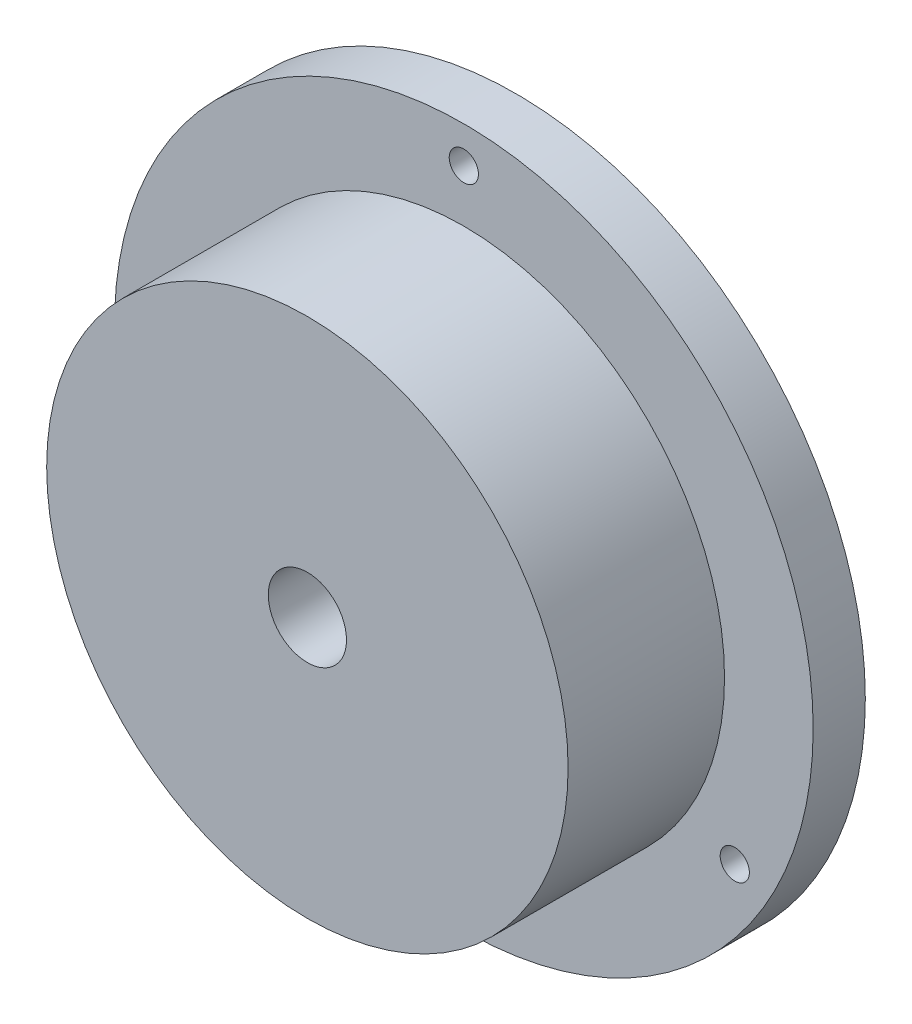
ISO-10303-21;
HEADER;
FILE_DESCRIPTION(('STEP AP214'),'2;1');
FILE_NAME('part.step','',(''),(''),'','','');
FILE_SCHEMA(('AUTOMOTIVE_DESIGN { 1 0 10303 214 1 1 1 1 }'));
ENDSEC;
DATA;
#1=APPLICATION_CONTEXT('core data for automotive mechanical design processes');
#2=APPLICATION_PROTOCOL_DEFINITION('international standard','automotive_design',2000,#1);
#3=PRODUCT_CONTEXT('',#1,'mechanical');
#4=PRODUCT('Part','Part','',(#3));
#5=PRODUCT_RELATED_PRODUCT_CATEGORY('part','',(#4));
#6=PRODUCT_DEFINITION_FORMATION('','',#4);
#7=PRODUCT_DEFINITION_CONTEXT('part definition',#1,'design');
#8=PRODUCT_DEFINITION('design','',#6,#7);
#9=PRODUCT_DEFINITION_SHAPE('','',#8);
#10=(LENGTH_UNIT() NAMED_UNIT(*) SI_UNIT(.MILLI.,.METRE.));
#11=(NAMED_UNIT(*) PLANE_ANGLE_UNIT() SI_UNIT($,.RADIAN.));
#12=(NAMED_UNIT(*) SI_UNIT($,.STERADIAN.) SOLID_ANGLE_UNIT());
#13=UNCERTAINTY_MEASURE_WITH_UNIT(LENGTH_MEASURE(1.E-05),#10,'distance_accuracy_value','');
#14=(GEOMETRIC_REPRESENTATION_CONTEXT(3) GLOBAL_UNCERTAINTY_ASSIGNED_CONTEXT((#13)) GLOBAL_UNIT_ASSIGNED_CONTEXT((#10,
#11,#12)) REPRESENTATION_CONTEXT('',''));
#15=CARTESIAN_POINT('',(0.,0.,0.));
#16=DIRECTION('',(0.,0.,1.));
#17=DIRECTION('',(1.,0.,0.));
#18=AXIS2_PLACEMENT_3D('',#15,#16,#17);
#19=CARTESIAN_POINT('',(0.,0.,12.7));
#20=DIRECTION('',(0.,0.,1.));
#21=DIRECTION('',(1.,0.,0.));
#22=AXIS2_PLACEMENT_3D('',#19,#20,#21);
#23=CYLINDRICAL_SURFACE('',#22,2.38125);
#24=CARTESIAN_POINT('',(0.,0.,12.7));
#25=DIRECTION('',(0.,0.,1.));
#26=DIRECTION('',(1.,0.,0.));
#27=AXIS2_PLACEMENT_3D('',#24,#25,#26);
#28=CIRCLE('',#27,2.38125);
#29=CARTESIAN_POINT('',(2.38125,0.,12.7));
#30=VERTEX_POINT('',#29);
#31=EDGE_CURVE('E110',#30,#30,#28,.T.);
#32=ORIENTED_EDGE('',*,*,#31,.T.);
#33=EDGE_LOOP('',(#32));
#34=FACE_BOUND('',#33,.T.);
#35=CARTESIAN_POINT('',(0.,-2.38125,6.1976));
#36=CARTESIAN_POINT('',(0.0850026886326464,-2.38123960433156,6.19761113758022));
#37=CARTESIAN_POINT('',(0.170131316329848,-2.37664946391161,6.20392546775647));
#38=CARTESIAN_POINT('',(0.337755059783042,-2.35869190693766,6.22881471892754));
#39=CARTESIAN_POINT('',(0.420242425476976,-2.34530077146967,6.2474227725432));
#40=CARTESIAN_POINT('',(0.579685383718676,-2.3110444534792,6.29566486900906));
#41=CARTESIAN_POINT('',(0.656670833789365,-2.29022398714768,6.32523298508959));
#42=CARTESIAN_POINT('',(0.804121583357064,-2.2427101352369,6.3940371811987));
#43=CARTESIAN_POINT('',(0.874589185048701,-2.21601883465752,6.43326982950487));
#44=CARTESIAN_POINT('',(1.01430090245177,-2.15588507582042,6.52409459531253));
#45=CARTESIAN_POINT('',(1.08285308650553,-2.12204969174514,6.57648544094934));
#46=CARTESIAN_POINT('',(1.21080470272799,-2.05174237657136,6.69009049033202));
#47=CARTESIAN_POINT('',(1.270189282637,-2.0152663048864,6.75131870721813));
#48=CARTESIAN_POINT('',(1.38971016924575,-1.93523893958423,6.89417583881912));
#49=CARTESIAN_POINT('',(1.44784748842795,-1.89165952804468,6.97747080558114));
#50=CARTESIAN_POINT('',(1.54942259100647,-1.80939145211568,7.15479069694342));
#51=CARTESIAN_POINT('',(1.59288306399383,-1.77069529703339,7.24879875594675));
#52=CARTESIAN_POINT('',(1.6515110829098,-1.7157853324708,7.41421694506738));
#53=CARTESIAN_POINT('',(1.67128299721248,-1.69636116750858,7.48291514070201));
#54=CARTESIAN_POINT('',(1.70229981474342,-1.66523744494414,7.62384002322995));
#55=CARTESIAN_POINT('',(1.71356344717716,-1.65352092795475,7.69605858521969));
#56=CARTESIAN_POINT('',(1.72683475835086,-1.63966394549644,7.84283309438511));
#57=CARTESIAN_POINT('',(1.72877569843226,-1.63759252994042,7.91740205948334));
#58=CARTESIAN_POINT('',(1.72304073615508,-1.64362211453728,8.06577442082653));
#59=CARTESIAN_POINT('',(1.71535760815299,-1.65173075777567,8.13957719986248));
#60=CARTESIAN_POINT('',(1.68957803909507,-1.67810723083093,8.29257628002333));
#61=CARTESIAN_POINT('',(1.67036546230521,-1.69745551741008,8.37138925715569));
#62=CARTESIAN_POINT('',(1.62204977634911,-1.74367919777594,8.52362041507012));
#63=CARTESIAN_POINT('',(1.59292394960002,-1.77057185542762,8.59702572919723));
#64=CARTESIAN_POINT('',(1.51471423008274,-1.83833394787484,8.76126310638399));
#65=CARTESIAN_POINT('',(1.46221424477206,-1.88087699027004,8.84976997668434));
#66=CARTESIAN_POINT('',(1.34301342448028,-1.96777264516445,9.01566163772194));
#67=CARTESIAN_POINT('',(1.27629735423009,-2.01212715744939,9.09303434583203));
#68=CARTESIAN_POINT('',(1.12847535091893,-2.09864840492193,9.23647471659115));
#69=CARTESIAN_POINT('',(1.04720504744989,-2.14078216870988,9.30239423842362));
#70=CARTESIAN_POINT('',(0.871809733853091,-2.2179778297542,9.41953266912506));
#71=CARTESIAN_POINT('',(0.777714967272673,-2.25305589822861,9.47078531033256));
#72=CARTESIAN_POINT('',(0.604259946447777,-2.30460239412803,9.54485148711709));
#73=CARTESIAN_POINT('',(0.527302322306033,-2.323536168006,9.57158706768968));
#74=CARTESIAN_POINT('',(0.368989387105585,-2.35386347811284,9.61410953681239));
#75=CARTESIAN_POINT('',(0.287637358620601,-2.36526256067551,9.62990447924661));
#76=CARTESIAN_POINT('',(0.122454278705588,-2.37954841202348,9.64966699006139));
#77=CARTESIAN_POINT('',(0.0386154257314912,-2.38240469972498,9.65359220726768));
#78=CARTESIAN_POINT('',(-0.128578592926906,-2.37924552667,9.64923613567525));
#79=CARTESIAN_POINT('',(-0.211933732532594,-2.37322959196239,9.64095419477428));
#80=CARTESIAN_POINT('',(-0.371043316082981,-2.35345669103941,9.61350070342755));
#81=CARTESIAN_POINT('',(-0.446963709197666,-2.34014335654487,9.5949526804647));
#82=CARTESIAN_POINT('',(-0.5943386705783,-2.30712418539987,9.54836387020833));
#83=CARTESIAN_POINT('',(-0.665792310843881,-2.28741702561531,9.52032111802927));
#84=CARTESIAN_POINT('',(-0.808876825277368,-2.24102584149144,9.45310219868711));
#85=CARTESIAN_POINT('',(-0.880010413329363,-2.21389235440178,9.4131843822084));
#86=CARTESIAN_POINT('',(-1.01481546062828,-2.15543724754085,9.32475671260323));
#87=CARTESIAN_POINT('',(-1.07848176702054,-2.12411276728229,9.27624098371926));
#88=CARTESIAN_POINT('',(-1.20880210442945,-2.05319387834803,9.1620698948424));
#89=CARTESIAN_POINT('',(-1.27387813674168,-2.01313394222891,9.09490250789191));
#90=CARTESIAN_POINT('',(-1.39246822660975,-1.93300382981878,8.95093892771693));
#91=CARTESIAN_POINT('',(-1.44597342724914,-1.89293366902414,8.87413542906708));
#92=CARTESIAN_POINT('',(-1.53459869637684,-1.82158573960677,8.72166329239791));
#93=CARTESIAN_POINT('',(-1.57118622216854,-1.78983638474929,8.64707240545384));
#94=CARTESIAN_POINT('',(-1.63380968661331,-1.7328625030002,8.49127920088952));
#95=CARTESIAN_POINT('',(-1.65986774424897,-1.70762433899344,8.41009117748196));
#96=CARTESIAN_POINT('',(-1.69573513310778,-1.67192696863984,8.25996110816251));
#97=CARTESIAN_POINT('',(-1.7078124305719,-1.65947333258575,8.19204812338322));
#98=CARTESIAN_POINT('',(-1.72372893138101,-1.64293943813523,8.05429269957786));
#99=CARTESIAN_POINT('',(-1.72757953164059,-1.63884759600954,7.98445306578228));
#100=CARTESIAN_POINT('',(-1.72676051192346,-1.63971018325818,7.84479423403456));
#101=CARTESIAN_POINT('',(-1.72208008245804,-1.644676089521,7.774975174277));
#102=CARTESIAN_POINT('',(-1.70454231189266,-1.66284037905774,7.63743107615923));
#103=CARTESIAN_POINT('',(-1.69167208120421,-1.67605173887857,7.56970951547473));
#104=CARTESIAN_POINT('',(-1.65336292846544,-1.71396218821014,7.4172968918053));
#105=CARTESIAN_POINT('',(-1.62526354650503,-1.74095357665873,7.33385875452051));
#106=CARTESIAN_POINT('',(-1.55797337456093,-1.80141977141974,7.17414437454155));
#107=CARTESIAN_POINT('',(-1.51876392056445,-1.83490545749492,7.0978804736133));
#108=CARTESIAN_POINT('',(-1.42901789326113,-1.90568159062989,6.95075659654733));
#109=CARTESIAN_POINT('',(-1.37818548390519,-1.9430542810767,6.88011782483561));
#110=CARTESIAN_POINT('',(-1.26647319139792,-2.01765105338166,6.74717259912349));
#111=CARTESIAN_POINT('',(-1.20558929257161,-2.05487506973078,6.68486949339195));
#112=CARTESIAN_POINT('',(-1.06030248569935,-2.13408522289339,6.55725035146471));
#113=CARTESIAN_POINT('',(-0.973646284282656,-2.1754260531323,6.49405719974357));
#114=CARTESIAN_POINT('',(-0.787339253804247,-2.24954133053765,6.38370675547761));
#115=CARTESIAN_POINT('',(-0.687707307748896,-2.28232802186435,6.33652651304381));
#116=CARTESIAN_POINT('',(-0.508130736991536,-2.32769312866698,6.27211177974633));
#117=CARTESIAN_POINT('',(-0.430634689864701,-2.34336641664608,6.25017773625332));
#118=CARTESIAN_POINT('',(-0.27233823329033,-2.36696643945198,6.21730625648848));
#119=CARTESIAN_POINT('',(-0.191548728880744,-2.37491686969282,6.20633518044543));
#120=CARTESIAN_POINT('',(-0.073605977182607,-2.38039995000909,6.19877268650992));
#121=CARTESIAN_POINT('',(-0.0368148002268589,-2.3812545023806,6.19759517629622));
#122=CARTESIAN_POINT('',(0.,-2.38125,6.1976));
#123=B_SPLINE_CURVE_WITH_KNOTS('',3,(#35,#36,#37,#38,#39,#40,#41,#42,#43,#44,#45,#46,#47,#48,
#49,#50,#51,#52,#53,#54,#55,#56,#57,#58,#59,#60,#61,#62,#63,#64,#65,#66,#67,#68,#69,#70,#71,#72,
#73,#74,#75,#76,#77,#78,#79,#80,#81,#82,#83,#84,#85,#86,#87,#88,#89,#90,#91,#92,#93,#94,#95,#96,
#97,#98,#99,#100,#101,#102,#103,#104,#105,#106,#107,#108,#109,#110,#111,#112,#113,#114,#115,
#116,#117,#118,#119,#120,#121,#122),.UNSPECIFIED.,.T.,.F.,(4,2,2,2,2,2,2,2,2,2,2,2,2,2,2,2,2,2,
2,2,2,2,2,2,2,2,2,2,2,2,2,2,2,2,2,2,2,2,2,2,2,2,2,4),(0.,0.2548830933614,0.51045593577906,
0.764515769514244,1.01848552033312,1.29551317251059,1.57298502551778,1.90315149563599,
2.23280518475108,2.45424568176368,2.67519729172836,2.897728301309,3.12042648488668,
3.36925669607236,3.61866101894232,3.95102540742185,4.28374779599991,4.62049667157489,
4.95646471735653,5.20634391844409,5.45603897642622,5.70662390125825,5.95722221273726,
6.19404725665838,6.43092134029436,6.68785236172495,6.94495965004154,7.24902420438134,
7.55332068812604,7.81925225383627,8.08462224290887,8.2940185714728,8.50312462270688,
8.7124958120391,8.92219733976997,9.19695182427461,9.47217063855799,9.75538067238812,
10.0387041266086,10.3816237075743,10.7240497160201,10.9691909074226,11.2135775538058,
11.3239678286811),.UNSPECIFIED.);
#124=CARTESIAN_POINT('',(0.,-2.38125,6.1976));
#125=VERTEX_POINT('',#124);
#126=EDGE_CURVE('E50',#125,#125,#123,.T.);
#127=ORIENTED_EDGE('',*,*,#126,.T.);
#128=EDGE_LOOP('',(#127));
#129=FACE_BOUND('',#128,.T.);
#130=CARTESIAN_POINT('',(0.,0.,3.8862));
#131=DIRECTION('',(0.,0.,-1.));
#132=DIRECTION('',(-1.,0.,0.));
#133=AXIS2_PLACEMENT_3D('',#130,#131,#132);
#134=CIRCLE('',#133,2.38125);
#135=CARTESIAN_POINT('',(-2.38125,0.,3.8862));
#136=VERTEX_POINT('',#135);
#137=EDGE_CURVE('E36',#136,#136,#134,.F.);
#138=ORIENTED_EDGE('',*,*,#137,.F.);
#139=EDGE_LOOP('',(#138));
#140=FACE_BOUND('',#139,.T.);
#141=ADVANCED_FACE('F32',(#34,#129,#140),#23,.F.);
#142=CARTESIAN_POINT('',(0.,0.,3.175));
#143=DIRECTION('',(0.,0.,1.));
#144=DIRECTION('',(1.,0.,0.));
#145=AXIS2_PLACEMENT_3D('',#142,#143,#144);
#146=PLANE('',#145);
#147=CARTESIAN_POINT('',(16.4977839420936,-9.52499999999985,3.175));
#148=DIRECTION('',(0.,0.,1.));
#149=DIRECTION('',(1.,0.,0.));
#150=AXIS2_PLACEMENT_3D('',#147,#148,#149);
#151=CIRCLE('',#150,0.888999999999987);
#152=CARTESIAN_POINT('',(17.3867839420936,-9.52499999999985,3.175));
#153=VERTEX_POINT('',#152);
#154=EDGE_CURVE('E81',#153,#153,#151,.T.);
#155=ORIENTED_EDGE('',*,*,#154,.F.);
#156=EDGE_LOOP('',(#155));
#157=FACE_BOUND('',#156,.T.);
#158=CARTESIAN_POINT('',(-16.4977839420935,-9.52500000000008,3.175));
#159=DIRECTION('',(0.,0.,1.));
#160=DIRECTION('',(1.,0.,0.));
#161=AXIS2_PLACEMENT_3D('',#158,#159,#160);
#162=CIRCLE('',#161,0.888999999999987);
#163=CARTESIAN_POINT('',(-15.6087839420935,-9.52500000000008,3.175));
#164=VERTEX_POINT('',#163);
#165=EDGE_CURVE('E219',#164,#164,#162,.T.);
#166=ORIENTED_EDGE('',*,*,#165,.F.);
#167=EDGE_LOOP('',(#166));
#168=FACE_BOUND('',#167,.T.);
#169=CARTESIAN_POINT('',(0.,19.05,3.175));
#170=DIRECTION('',(0.,0.,1.));
#171=DIRECTION('',(1.,0.,0.));
#172=AXIS2_PLACEMENT_3D('',#169,#170,#171);
#173=CIRCLE('',#172,0.888999999999987);
#174=CARTESIAN_POINT('',(0.888999999999987,19.05,3.175));
#175=VERTEX_POINT('',#174);
#176=EDGE_CURVE('E213',#175,#175,#173,.T.);
#177=ORIENTED_EDGE('',*,*,#176,.F.);
#178=EDGE_LOOP('',(#177));
#179=FACE_BOUND('',#178,.T.);
#180=CARTESIAN_POINT('',(0.,0.,3.175));
#181=DIRECTION('',(0.,0.,1.));
#182=DIRECTION('',(1.,0.,0.));
#183=AXIS2_PLACEMENT_3D('',#180,#181,#182);
#184=CIRCLE('',#183,21.2725);
#185=CARTESIAN_POINT('',(21.2725,0.,3.175));
#186=VERTEX_POINT('',#185);
#187=EDGE_CURVE('E10',#186,#186,#184,.T.);
#188=ORIENTED_EDGE('',*,*,#187,.T.);
#189=EDGE_LOOP('',(#188));
#190=FACE_BOUND('',#189,.T.);
#191=CARTESIAN_POINT('',(0.,0.,3.175));
#192=DIRECTION('',(0.,0.,1.));
#193=DIRECTION('',(1.,0.,0.));
#194=AXIS2_PLACEMENT_3D('',#191,#192,#193);
#195=CIRCLE('',#194,15.875);
#196=CARTESIAN_POINT('',(15.875,0.,3.175));
#197=VERTEX_POINT('',#196);
#198=EDGE_CURVE('E48',#197,#197,#195,.T.);
#199=ORIENTED_EDGE('',*,*,#198,.F.);
#200=EDGE_LOOP('',(#199));
#201=FACE_BOUND('',#200,.T.);
#202=ADVANCED_FACE('F92',(#157,#168,#179,#190,#201),#146,.T.);
#203=CARTESIAN_POINT('',(0.,0.,3.175));
#204=DIRECTION('',(0.,0.,-1.));
#205=DIRECTION('',(-1.,0.,0.));
#206=AXIS2_PLACEMENT_3D('',#203,#204,#205);
#207=CYLINDRICAL_SURFACE('',#206,21.2725);
#208=ORIENTED_EDGE('',*,*,#187,.F.);
#209=EDGE_LOOP('',(#208));
#210=FACE_BOUND('',#209,.T.);
#211=CARTESIAN_POINT('',(0.,0.,0.));
#212=DIRECTION('',(0.,0.,1.));
#213=DIRECTION('',(1.,0.,0.));
#214=AXIS2_PLACEMENT_3D('',#211,#212,#213);
#215=CIRCLE('',#214,21.2725);
#216=CARTESIAN_POINT('',(21.2725,0.,0.));
#217=VERTEX_POINT('',#216);
#218=EDGE_CURVE('E40',#217,#217,#215,.T.);
#219=ORIENTED_EDGE('',*,*,#218,.T.);
#220=EDGE_LOOP('',(#219));
#221=FACE_BOUND('',#220,.T.);
#222=ADVANCED_FACE('F34',(#210,#221),#207,.T.);
#223=CARTESIAN_POINT('',(0.,0.,0.));
#224=DIRECTION('',(0.,0.,1.));
#225=DIRECTION('',(1.,0.,0.));
#226=AXIS2_PLACEMENT_3D('',#223,#224,#225);
#227=PLANE('',#226);
#228=CARTESIAN_POINT('',(0.,0.,0.));
#229=DIRECTION('',(0.,0.,-1.));
#230=DIRECTION('',(-1.,0.,0.));
#231=AXIS2_PLACEMENT_3D('',#228,#229,#230);
#232=CIRCLE('',#231,7.9375);
#233=CARTESIAN_POINT('',(-7.9375,0.,0.));
#234=VERTEX_POINT('',#233);
#235=EDGE_CURVE('E82',#234,#234,#232,.T.);
#236=ORIENTED_EDGE('',*,*,#235,.F.);
#237=EDGE_LOOP('',(#236));
#238=FACE_BOUND('',#237,.T.);
#239=CARTESIAN_POINT('',(16.4977839420936,-9.52499999999985,0.));
#240=DIRECTION('',(0.,0.,1.));
#241=DIRECTION('',(1.,0.,0.));
#242=AXIS2_PLACEMENT_3D('',#239,#240,#241);
#243=CIRCLE('',#242,0.888999999999997);
#244=CARTESIAN_POINT('',(17.3867839420936,-9.52499999999985,0.));
#245=VERTEX_POINT('',#244);
#246=EDGE_CURVE('E221',#245,#245,#243,.T.);
#247=ORIENTED_EDGE('',*,*,#246,.T.);
#248=EDGE_LOOP('',(#247));
#249=FACE_BOUND('',#248,.T.);
#250=CARTESIAN_POINT('',(-16.4977839420935,-9.52500000000008,0.));
#251=DIRECTION('',(0.,0.,1.));
#252=DIRECTION('',(1.,0.,0.));
#253=AXIS2_PLACEMENT_3D('',#250,#251,#252);
#254=CIRCLE('',#253,0.888999999999999);
#255=CARTESIAN_POINT('',(-15.6087839420935,-9.52500000000008,0.));
#256=VERTEX_POINT('',#255);
#257=EDGE_CURVE('E216',#256,#256,#254,.T.);
#258=ORIENTED_EDGE('',*,*,#257,.T.);
#259=EDGE_LOOP('',(#258));
#260=FACE_BOUND('',#259,.T.);
#261=CARTESIAN_POINT('',(0.,19.05,0.));
#262=DIRECTION('',(0.,0.,1.));
#263=DIRECTION('',(1.,0.,0.));
#264=AXIS2_PLACEMENT_3D('',#261,#262,#263);
#265=CIRCLE('',#264,0.888999999999998);
#266=CARTESIAN_POINT('',(0.888999999999998,19.05,0.));
#267=VERTEX_POINT('',#266);
#268=EDGE_CURVE('E210',#267,#267,#265,.T.);
#269=ORIENTED_EDGE('',*,*,#268,.T.);
#270=EDGE_LOOP('',(#269));
#271=FACE_BOUND('',#270,.T.);
#272=ORIENTED_EDGE('',*,*,#218,.F.);
#273=EDGE_LOOP('',(#272));
#274=FACE_BOUND('',#273,.T.);
#275=ADVANCED_FACE('F90',(#238,#249,#260,#271,#274),#227,.F.);
#276=CARTESIAN_POINT('',(0.,0.,12.7));
#277=DIRECTION('',(0.,0.,-1.));
#278=DIRECTION('',(-1.,0.,0.));
#279=AXIS2_PLACEMENT_3D('',#276,#277,#278);
#280=CYLINDRICAL_SURFACE('',#279,15.875);
#281=CARTESIAN_POINT('',(0.,-15.875,6.1976));
#282=CARTESIAN_POINT('',(-0.0967109410735142,-15.8749988004531,6.19760416389285));
#283=CARTESIAN_POINT('',(-0.193484678630448,-15.8741068793742,6.20575005051755));
#284=CARTESIAN_POINT('',(-0.384345958728122,-15.8706346034328,6.23812078433042));
#285=CARTESIAN_POINT('',(-0.47843047711299,-15.8680524201679,6.2623630438082));
#286=CARTESIAN_POINT('',(-0.66112206649134,-15.8614909109532,6.32620960757611));
#287=CARTESIAN_POINT('',(-0.74973252983398,-15.8575124607145,6.36580428475969));
#288=CARTESIAN_POINT('',(-0.919031731503223,-15.8486024989643,6.45921223983568));
#289=CARTESIAN_POINT('',(-0.999721969988388,-15.8436711684637,6.51302281795911));
#290=CARTESIAN_POINT('',(-1.15124953336445,-15.8333839621394,6.6335786471546));
#291=CARTESIAN_POINT('',(-1.2220486559737,-15.8280265592031,6.70037178928638));
#292=CARTESIAN_POINT('',(-1.35145567440715,-15.8175035433589,6.84489428926095));
#293=CARTESIAN_POINT('',(-1.41006298830151,-15.8123379396155,6.9226241688308));
#294=CARTESIAN_POINT('',(-1.51356059740835,-15.8027680257007,7.08705611926943));
#295=CARTESIAN_POINT('',(-1.55841588273034,-15.7983656707722,7.17378034981003));
#296=CARTESIAN_POINT('',(-1.63291260953262,-15.7908401195917,7.35358600422935));
#297=CARTESIAN_POINT('',(-1.6625544920372,-15.7877168862595,7.44666724373486));
#298=CARTESIAN_POINT('',(-1.70566869644553,-15.7831173206578,7.63615243405794));
#299=CARTESIAN_POINT('',(-1.71920481529205,-15.7816344921914,7.73254170857462));
#300=CARTESIAN_POINT('',(-1.72992052713317,-15.7804635748137,7.92623446620125));
#301=CARTESIAN_POINT('',(-1.72710062425111,-15.7807754305868,8.02353792104216));
#302=CARTESIAN_POINT('',(-1.70523684969685,-15.7831527073322,8.21585560673391));
#303=CARTESIAN_POINT('',(-1.68626283548068,-15.7852105776411,8.31087788588309));
#304=CARTESIAN_POINT('',(-1.63273823523889,-15.7908362285474,8.49638137114754));
#305=CARTESIAN_POINT('',(-1.59818740414012,-15.7944040329009,8.5868625057912));
#306=CARTESIAN_POINT('',(-1.51441349592697,-15.802656203886,8.76093475738922));
#307=CARTESIAN_POINT('',(-1.46515963404753,-15.8073429090746,8.84451094351193));
#308=CARTESIAN_POINT('',(-1.35339988743408,-15.817302894966,9.00223741950793));
#309=CARTESIAN_POINT('',(-1.29089354328807,-15.8225761960008,9.07638738246816));
#310=CARTESIAN_POINT('',(-1.15401397309561,-15.8331488351424,9.21356235619126));
#311=CARTESIAN_POINT('',(-1.07958045426567,-15.8384481653419,9.27652722026963));
#312=CARTESIAN_POINT('',(-0.921168208981226,-15.8484498335253,9.38907777733182));
#313=CARTESIAN_POINT('',(-0.837189468610389,-15.8531521706387,9.43866345080925));
#314=CARTESIAN_POINT('',(-0.662027415032831,-15.86143199394,9.52304645985648));
#315=CARTESIAN_POINT('',(-0.570842506744004,-15.8650092302097,9.55784051037289));
#316=CARTESIAN_POINT('',(-0.383877203322956,-15.8706333546968,9.61160732277614));
#317=CARTESIAN_POINT('',(-0.288096971087188,-15.872680297118,9.63058064504343));
#318=CARTESIAN_POINT('',(-0.0951804717098272,-15.8750062116698,9.65209057523174));
#319=CARTESIAN_POINT('',(0.00194644336352407,-15.8752941060143,9.65471013391056));
#320=CARTESIAN_POINT('',(0.195256130307848,-15.8740934651652,9.64365638543301));
#321=CARTESIAN_POINT('',(0.291438917298992,-15.8726049584676,9.62998333963262));
#322=CARTESIAN_POINT('',(0.479888905654951,-15.8680244211692,9.58680136032595));
#323=CARTESIAN_POINT('',(0.572165164636429,-15.864936347678,9.55733149973937));
#324=CARTESIAN_POINT('',(0.750464852883222,-15.8575028687365,9.48343273871489));
#325=CARTESIAN_POINT('',(0.836488117766245,-15.8531574302469,9.43900344518764));
#326=CARTESIAN_POINT('',(1.00021348936993,-15.843672496213,9.33624292985556));
#327=CARTESIAN_POINT('',(1.07788138149219,-15.8385299316185,9.27785748285233));
#328=CARTESIAN_POINT('',(1.22234438688751,-15.8280370029289,9.14891941726788));
#329=CARTESIAN_POINT('',(1.28913917586977,-15.822686632642,9.0783664359186));
#330=CARTESIAN_POINT('',(1.41025000009175,-15.8123540380528,8.92673295028301));
#331=CARTESIAN_POINT('',(1.46451141310147,-15.8073734870953,8.84560868853185));
#332=CARTESIAN_POINT('',(1.55863910323598,-15.7983706263709,8.67535013457682));
#333=CARTESIAN_POINT('',(1.5985056080642,-15.7943483014468,8.58621596910412));
#334=CARTESIAN_POINT('',(1.66262135317543,-15.7877281172567,8.40265149020378));
#335=CARTESIAN_POINT('',(1.68690253454864,-15.7851273462454,8.30823244262744));
#336=CARTESIAN_POINT('',(1.71926177779107,-15.7816359451561,8.1166275311174));
#337=CARTESIAN_POINT('',(1.72734039786619,-15.7807452561629,8.01944176261896));
#338=CARTESIAN_POINT('',(1.72705663833689,-15.7807762712172,7.82560519908621));
#339=CARTESIAN_POINT('',(1.71878006152703,-15.7816885166959,7.7289542655532));
#340=CARTESIAN_POINT('',(1.6862013412282,-15.7852023923203,7.5384249800142));
#341=CARTESIAN_POINT('',(1.66189918441038,-15.7878040238711,7.44454663031429));
#342=CARTESIAN_POINT('',(1.59798389301986,-15.7944008124682,7.26223156307745));
#343=CARTESIAN_POINT('',(1.55837381767599,-15.7983956910638,7.17379376235855));
#344=CARTESIAN_POINT('',(1.46497571588091,-15.80732938545,7.00480744711437));
#345=CARTESIAN_POINT('',(1.41118768392724,-15.8122682016069,6.92425893565092));
#346=CARTESIAN_POINT('',(1.29063929818695,-15.8225643560012,6.77289813648103));
#347=CARTESIAN_POINT('',(1.22381494728259,-15.8279236776293,6.70213695090774));
#348=CARTESIAN_POINT('',(1.07922065258758,-15.8384390282537,6.57279678224059));
#349=CARTESIAN_POINT('',(1.00144810527591,-15.8435950085201,6.51422070504329));
#350=CARTESIAN_POINT('',(0.836911086850277,-15.8531388217839,6.41077420343762));
#351=CARTESIAN_POINT('',(0.750120961710308,-15.8575243621506,6.36594439890857));
#352=CARTESIAN_POINT('',(0.570250187495908,-15.8650089557435,6.29155606902548));
#353=CARTESIAN_POINT('',(0.477176678832001,-15.868109441608,6.26198052846532));
#354=CARTESIAN_POINT('',(0.319658768061273,-15.8719058056913,6.22621912772198));
#355=CARTESIAN_POINT('',(0.256217154925606,-15.8730606393915,6.21550186382884));
#356=CARTESIAN_POINT('',(0.128526271540883,-15.8746081332279,6.20119093442634));
#357=CARTESIAN_POINT('',(0.064277005416565,-15.875000797255,6.19759723255135));
#358=CARTESIAN_POINT('',(0.,-15.875,6.1976));
#359=B_SPLINE_CURVE_WITH_KNOTS('',3,(#281,#282,#283,#284,#285,#286,#287,#288,#289,#290,#291,
#292,#293,#294,#295,#296,#297,#298,#299,#300,#301,#302,#303,#304,#305,#306,#307,#308,#309,#310,
#311,#312,#313,#314,#315,#316,#317,#318,#319,#320,#321,#322,#323,#324,#325,#326,#327,#328,#329,
#330,#331,#332,#333,#334,#335,#336,#337,#338,#339,#340,#341,#342,#343,#344,#345,#346,#347,#348,
#349,#350,#351,#352,#353,#354,#355,#356,#357,#358),.UNSPECIFIED.,.T.,.F.,(4,2,2,2,2,2,2,2,2,2,2,
2,2,2,2,2,2,2,2,2,2,2,2,2,2,2,2,2,2,2,2,2,2,2,2,2,2,2,4),(0.,0.289898085972432,
0.580110281915709,0.870140786800577,1.16011625098227,1.45118242655957,1.74226249189319,
2.03407755017991,2.32588414850551,2.61653097493721,2.90716884313499,3.19655621275472,
3.48594813552219,3.77595027979584,4.0659624789597,4.35748985706577,4.64901766020623,
4.94061017461775,5.23219236019449,5.52229435149331,5.81239168921635,6.10177476924651,
6.39116545399566,6.6816993555946,6.97224192079344,7.26402777642079,7.5558090162807,
7.84699034417928,8.1381616402116,8.42780944565579,8.71745749200704,9.00704768321472,
9.29663798681254,9.587687427571,9.87880619823589,10.1707771065549,10.462421630854,
10.6550976172655,10.8477726200673),.UNSPECIFIED.);
#360=CARTESIAN_POINT('',(0.,-15.875,6.1976));
#361=VERTEX_POINT('',#360);
#362=EDGE_CURVE('E57',#361,#361,#359,.T.);
#363=ORIENTED_EDGE('',*,*,#362,.T.);
#364=EDGE_LOOP('',(#363));
#365=FACE_BOUND('',#364,.T.);
#366=CARTESIAN_POINT('',(0.,0.,12.7));
#367=DIRECTION('',(0.,0.,1.));
#368=DIRECTION('',(1.,0.,0.));
#369=AXIS2_PLACEMENT_3D('',#366,#367,#368);
#370=CIRCLE('',#369,15.875);
#371=CARTESIAN_POINT('',(15.875,0.,12.7));
#372=VERTEX_POINT('',#371);
#373=EDGE_CURVE('E45',#372,#372,#370,.T.);
#374=ORIENTED_EDGE('',*,*,#373,.F.);
#375=EDGE_LOOP('',(#374));
#376=FACE_BOUND('',#375,.T.);
#377=ORIENTED_EDGE('',*,*,#198,.T.);
#378=EDGE_LOOP('',(#377));
#379=FACE_BOUND('',#378,.T.);
#380=ADVANCED_FACE('F85',(#365,#376,#379),#280,.T.);
#381=CARTESIAN_POINT('',(0.,0.,12.7));
#382=DIRECTION('',(0.,0.,1.));
#383=DIRECTION('',(1.,0.,0.));
#384=AXIS2_PLACEMENT_3D('',#381,#382,#383);
#385=PLANE('',#384);
#386=ORIENTED_EDGE('',*,*,#31,.F.);
#387=EDGE_LOOP('',(#386));
#388=FACE_BOUND('',#387,.T.);
#389=ORIENTED_EDGE('',*,*,#373,.T.);
#390=EDGE_LOOP('',(#389));
#391=FACE_BOUND('',#390,.T.);
#392=ADVANCED_FACE('F89',(#388,#391),#385,.T.);
#393=CARTESIAN_POINT('',(0.,19.05,3.175));
#394=DIRECTION('',(0.,0.,1.));
#395=DIRECTION('',(1.,0.,0.));
#396=AXIS2_PLACEMENT_3D('',#393,#394,#395);
#397=CYLINDRICAL_SURFACE('',#396,0.888999999999993);
#398=ORIENTED_EDGE('',*,*,#268,.F.);
#399=EDGE_LOOP('',(#398));
#400=FACE_BOUND('',#399,.T.);
#401=ORIENTED_EDGE('',*,*,#176,.T.);
#402=EDGE_LOOP('',(#401));
#403=FACE_BOUND('',#402,.T.);
#404=ADVANCED_FACE('F147',(#400,#403),#397,.F.);
#405=CARTESIAN_POINT('',(-16.4977839420935,-9.52500000000008,3.175));
#406=DIRECTION('',(0.,0.,1.));
#407=DIRECTION('',(1.,0.,0.));
#408=AXIS2_PLACEMENT_3D('',#405,#406,#407);
#409=CYLINDRICAL_SURFACE('',#408,0.888999999999993);
#410=ORIENTED_EDGE('',*,*,#257,.F.);
#411=EDGE_LOOP('',(#410));
#412=FACE_BOUND('',#411,.T.);
#413=ORIENTED_EDGE('',*,*,#165,.T.);
#414=EDGE_LOOP('',(#413));
#415=FACE_BOUND('',#414,.T.);
#416=ADVANCED_FACE('F140',(#412,#415),#409,.F.);
#417=CARTESIAN_POINT('',(16.4977839420936,-9.52499999999985,3.175));
#418=DIRECTION('',(0.,0.,1.));
#419=DIRECTION('',(1.,0.,0.));
#420=AXIS2_PLACEMENT_3D('',#417,#418,#419);
#421=CYLINDRICAL_SURFACE('',#420,0.888999999999992);
#422=ORIENTED_EDGE('',*,*,#246,.F.);
#423=EDGE_LOOP('',(#422));
#424=FACE_BOUND('',#423,.T.);
#425=ORIENTED_EDGE('',*,*,#154,.T.);
#426=EDGE_LOOP('',(#425));
#427=FACE_BOUND('',#426,.T.);
#428=ADVANCED_FACE('F67',(#424,#427),#421,.F.);
#429=CARTESIAN_POINT('',(0.,-21.2725,7.9248));
#430=DIRECTION('',(0.,-1.,0.));
#431=DIRECTION('',(0.,0.,-1.));
#432=AXIS2_PLACEMENT_3D('',#429,#430,#431);
#433=CYLINDRICAL_SURFACE('',#432,1.7272);
#434=ORIENTED_EDGE('',*,*,#126,.F.);
#435=EDGE_LOOP('',(#434));
#436=FACE_BOUND('',#435,.T.);
#437=ORIENTED_EDGE('',*,*,#362,.F.);
#438=EDGE_LOOP('',(#437));
#439=FACE_BOUND('',#438,.T.);
#440=ADVANCED_FACE('F61',(#436,#439),#433,.F.);
#441=CARTESIAN_POINT('',(0.,0.,3.8862));
#442=DIRECTION('',(0.,0.,-1.));
#443=DIRECTION('',(-1.,0.,0.));
#444=AXIS2_PLACEMENT_3D('',#441,#442,#443);
#445=PLANE('',#444);
#446=CARTESIAN_POINT('',(0.,0.,3.8862));
#447=DIRECTION('',(0.,0.,-1.));
#448=DIRECTION('',(-1.,0.,0.));
#449=AXIS2_PLACEMENT_3D('',#446,#447,#448);
#450=CIRCLE('',#449,7.9375);
#451=CARTESIAN_POINT('',(-7.9375,0.,3.8862));
#452=VERTEX_POINT('',#451);
#453=EDGE_CURVE('E116',#452,#452,#450,.T.);
#454=ORIENTED_EDGE('',*,*,#453,.T.);
#455=EDGE_LOOP('',(#454));
#456=FACE_BOUND('',#455,.T.);
#457=ORIENTED_EDGE('',*,*,#137,.T.);
#458=EDGE_LOOP('',(#457));
#459=FACE_BOUND('',#458,.T.);
#460=ADVANCED_FACE('F66',(#456,#459),#445,.T.);
#461=CARTESIAN_POINT('',(0.,0.,3.8862));
#462=DIRECTION('',(0.,0.,-1.));
#463=DIRECTION('',(-1.,0.,0.));
#464=AXIS2_PLACEMENT_3D('',#461,#462,#463);
#465=CYLINDRICAL_SURFACE('',#464,7.9375);
#466=CARTESIAN_POINT('',(-7.9375,0.,3.8862));
#467=CARTESIAN_POINT('',(-7.9375,0.,3.84571875));
#468=CARTESIAN_POINT('',(-7.9375,0.,3.8052375));
#469=CARTESIAN_POINT('',(-7.9375,0.,3.724275));
#470=CARTESIAN_POINT('',(-7.9375,0.,3.68379375));
#471=CARTESIAN_POINT('',(-7.9375,0.,3.60283125));
#472=CARTESIAN_POINT('',(-7.9375,0.,3.56235));
#473=CARTESIAN_POINT('',(-7.9375,0.,3.4813875));
#474=CARTESIAN_POINT('',(-7.9375,0.,3.44090625));
#475=CARTESIAN_POINT('',(-7.9375,0.,3.35994375));
#476=CARTESIAN_POINT('',(-7.9375,0.,3.3194625));
#477=CARTESIAN_POINT('',(-7.9375,0.,3.2385));
#478=CARTESIAN_POINT('',(-7.9375,0.,3.19801875));
#479=CARTESIAN_POINT('',(-7.9375,0.,3.11705625));
#480=CARTESIAN_POINT('',(-7.9375,0.,3.076575));
#481=CARTESIAN_POINT('',(-7.9375,0.,2.9956125));
#482=CARTESIAN_POINT('',(-7.9375,0.,2.95513125));
#483=CARTESIAN_POINT('',(-7.9375,0.,2.87416875));
#484=CARTESIAN_POINT('',(-7.9375,0.,2.8336875));
#485=CARTESIAN_POINT('',(-7.9375,0.,2.752725));
#486=CARTESIAN_POINT('',(-7.9375,0.,2.71224375));
#487=CARTESIAN_POINT('',(-7.9375,0.,2.63128125));
#488=CARTESIAN_POINT('',(-7.9375,0.,2.5908));
#489=CARTESIAN_POINT('',(-7.9375,0.,2.5098375));
#490=CARTESIAN_POINT('',(-7.9375,0.,2.46935625));
#491=CARTESIAN_POINT('',(-7.9375,0.,2.38839375));
#492=CARTESIAN_POINT('',(-7.9375,0.,2.3479125));
#493=CARTESIAN_POINT('',(-7.9375,0.,2.26695));
#494=CARTESIAN_POINT('',(-7.9375,0.,2.22646875));
#495=CARTESIAN_POINT('',(-7.9375,0.,2.14550625));
#496=CARTESIAN_POINT('',(-7.9375,0.,2.105025));
#497=CARTESIAN_POINT('',(-7.9375,0.,2.0240625));
#498=CARTESIAN_POINT('',(-7.9375,0.,1.98358125));
#499=CARTESIAN_POINT('',(-7.9375,0.,1.90261875));
#500=CARTESIAN_POINT('',(-7.9375,0.,1.8621375));
#501=CARTESIAN_POINT('',(-7.9375,0.,1.781175));
#502=CARTESIAN_POINT('',(-7.9375,0.,1.74069375));
#503=CARTESIAN_POINT('',(-7.9375,0.,1.65973125));
#504=CARTESIAN_POINT('',(-7.9375,0.,1.61925));
#505=CARTESIAN_POINT('',(-7.9375,0.,1.5382875));
#506=CARTESIAN_POINT('',(-7.9375,0.,1.49780625));
#507=CARTESIAN_POINT('',(-7.9375,0.,1.41684375));
#508=CARTESIAN_POINT('',(-7.9375,0.,1.3763625));
#509=CARTESIAN_POINT('',(-7.9375,0.,1.2954));
#510=CARTESIAN_POINT('',(-7.9375,0.,1.25491875));
#511=CARTESIAN_POINT('',(-7.9375,0.,1.17395625));
#512=CARTESIAN_POINT('',(-7.9375,0.,1.133475));
#513=CARTESIAN_POINT('',(-7.9375,0.,1.0525125));
#514=CARTESIAN_POINT('',(-7.9375,0.,1.01203125));
#515=CARTESIAN_POINT('',(-7.9375,0.,0.93106875));
#516=CARTESIAN_POINT('',(-7.9375,0.,0.8905875));
#517=CARTESIAN_POINT('',(-7.9375,0.,0.809625));
#518=CARTESIAN_POINT('',(-7.9375,0.,0.76914375));
#519=CARTESIAN_POINT('',(-7.9375,0.,0.68818125));
#520=CARTESIAN_POINT('',(-7.9375,0.,0.6477));
#521=CARTESIAN_POINT('',(-7.9375,0.,0.5667375));
#522=CARTESIAN_POINT('',(-7.9375,0.,0.52625625));
#523=CARTESIAN_POINT('',(-7.9375,0.,0.44529375));
#524=CARTESIAN_POINT('',(-7.9375,0.,0.4048125));
#525=CARTESIAN_POINT('',(-7.9375,0.,0.32385));
#526=CARTESIAN_POINT('',(-7.9375,0.,0.28336875));
#527=CARTESIAN_POINT('',(-7.9375,0.,0.20240625));
#528=CARTESIAN_POINT('',(-7.9375,0.,0.161925));
#529=CARTESIAN_POINT('',(-7.9375,0.,0.0809625000000001));
#530=CARTESIAN_POINT('',(-7.9375,0.,0.0404812500000001));
#531=CARTESIAN_POINT('',(-7.9375,0.,0.));
#532=B_SPLINE_CURVE_WITH_KNOTS('',3,(#466,#467,#468,#469,#470,#471,#472,#473,#474,#475,#476,
#477,#478,#479,#480,#481,#482,#483,#484,#485,#486,#487,#488,#489,#490,#491,#492,#493,#494,#495,
#496,#497,#498,#499,#500,#501,#502,#503,#504,#505,#506,#507,#508,#509,#510,#511,#512,#513,#514,
#515,#516,#517,#518,#519,#520,#521,#522,#523,#524,#525,#526,#527,#528,#529,#530,#531),
.UNSPECIFIED.,.F.,.F.,(4,2,2,2,2,2,2,2,2,2,2,2,2,2,2,2,2,2,2,2,2,2,2,2,2,2,2,2,2,2,2,2,4),(0.,
0.12144375,0.2428875,0.36433125,0.485775,0.60721875,0.7286625,0.85010625,0.97155,1.09299375,
1.2144375,1.33588125,1.457325,1.57876875,1.7002125,1.82165625,1.9431,2.06454375,2.1859875,
2.30743125,2.428875,2.55031875,2.6717625,2.79320625,2.91465,3.03609375,3.1575375,3.27898125,
3.400425,3.52186875,3.6433125,3.76475625,3.8862),.UNSPECIFIED.);
#533=EDGE_CURVE('BSEAM69',#452,#234,#532,.T.);
#534=ORIENTED_EDGE('',*,*,#453,.F.);
#535=ORIENTED_EDGE('',*,*,#235,.T.);
#536=ORIENTED_EDGE('',*,*,#533,.T.);
#537=ORIENTED_EDGE('',*,*,#533,.F.);
#538=EDGE_LOOP('',(#534,#536,#535,#537));
#539=FACE_BOUND('',#538,.T.);
#540=ADVANCED_FACE('F69',(#539),#465,.F.);
#541=CLOSED_SHELL('',(#141,#202,#222,#275,#380,#392,#404,#416,#428,#440,#460,#540));
#542=MANIFOLD_SOLID_BREP('B2',#541);
#543=ADVANCED_BREP_SHAPE_REPRESENTATION('',(#18,#542),#14);
#544=SHAPE_DEFINITION_REPRESENTATION(#9,#543);
ENDSEC;
END-ISO-10303-21;
